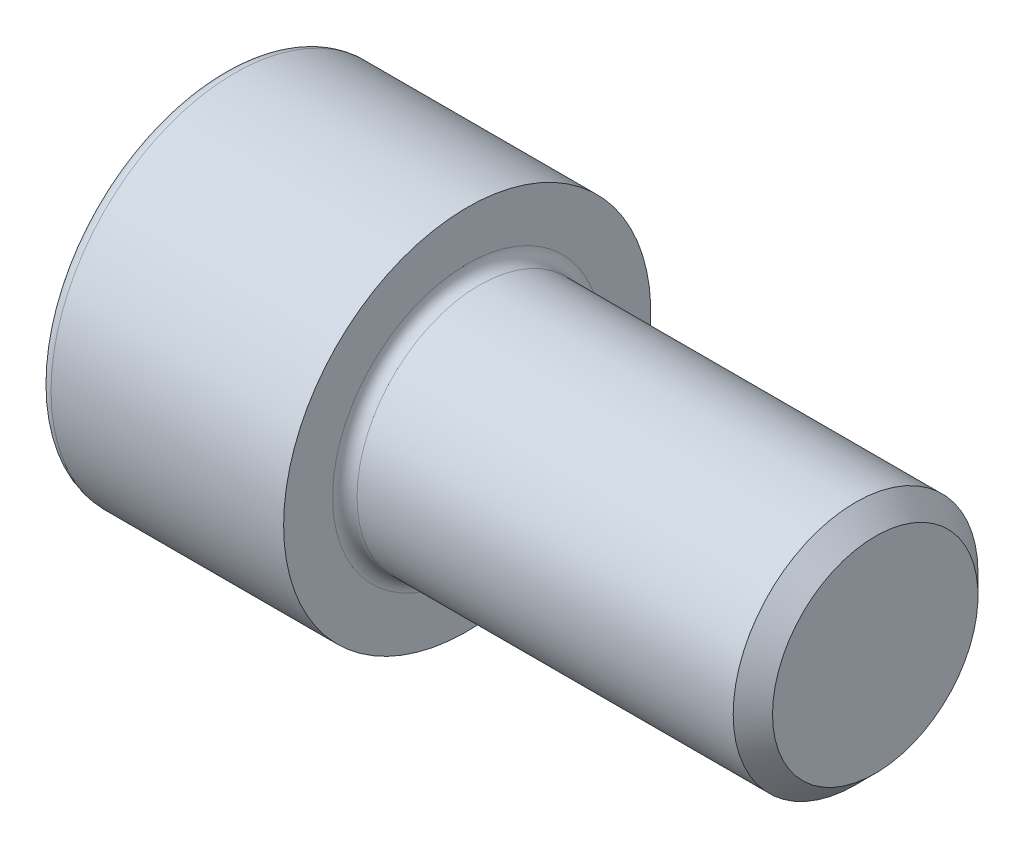
ISO-10303-21;
HEADER;
FILE_DESCRIPTION(('STEP AP214'),'2;1');
FILE_NAME('part.step','',(''),(''),'','','');
FILE_SCHEMA(('AUTOMOTIVE_DESIGN { 1 0 10303 214 1 1 1 1 }'));
ENDSEC;
DATA;
#1=APPLICATION_CONTEXT('core data for automotive mechanical design processes');
#2=APPLICATION_PROTOCOL_DEFINITION('international standard','automotive_design',2000,#1);
#3=PRODUCT_CONTEXT('',#1,'mechanical');
#4=PRODUCT('Part','Part','',(#3));
#5=PRODUCT_RELATED_PRODUCT_CATEGORY('part','',(#4));
#6=PRODUCT_DEFINITION_FORMATION('','',#4);
#7=PRODUCT_DEFINITION_CONTEXT('part definition',#1,'design');
#8=PRODUCT_DEFINITION('design','',#6,#7);
#9=PRODUCT_DEFINITION_SHAPE('','',#8);
#10=(LENGTH_UNIT() NAMED_UNIT(*) SI_UNIT(.MILLI.,.METRE.));
#11=(NAMED_UNIT(*) PLANE_ANGLE_UNIT() SI_UNIT($,.RADIAN.));
#12=(NAMED_UNIT(*) SI_UNIT($,.STERADIAN.) SOLID_ANGLE_UNIT());
#13=UNCERTAINTY_MEASURE_WITH_UNIT(LENGTH_MEASURE(1.E-05),#10,'distance_accuracy_value','');
#14=(GEOMETRIC_REPRESENTATION_CONTEXT(3) GLOBAL_UNCERTAINTY_ASSIGNED_CONTEXT((#13)) GLOBAL_UNIT_ASSIGNED_CONTEXT((#10,
#11,#12)) REPRESENTATION_CONTEXT('',''));
#15=CARTESIAN_POINT('',(0.,0.,0.));
#16=DIRECTION('',(0.,0.,1.));
#17=DIRECTION('',(1.,0.,0.));
#18=AXIS2_PLACEMENT_3D('',#15,#16,#17);
#19=CARTESIAN_POINT('',(0.,0.,0.));
#20=DIRECTION('',(-1.,0.,0.));
#21=DIRECTION('',(0.,0.,1.));
#22=AXIS2_PLACEMENT_3D('',#19,#20,#21);
#23=PLANE('',#22);
#24=DIRECTION('',(0.,-0.499999999999999,0.866025403784439));
#25=VECTOR('',#24,1.);
#26=CARTESIAN_POINT('',(0.,5.83989797285306,0.));
#27=LINE('',#26,#25);
#28=CARTESIAN_POINT('',(0.,5.83989797285306,0.));
#29=VERTEX_POINT('',#28);
#30=CARTESIAN_POINT('',(0.,2.91994898642654,5.05749999999999));
#31=VERTEX_POINT('',#30);
#32=EDGE_CURVE('E258',#29,#31,#27,.T.);
#33=ORIENTED_EDGE('',*,*,#32,.T.);
#34=DIRECTION('',(0.,1.,0.));
#35=VECTOR('',#34,1.);
#36=CARTESIAN_POINT('',(0.,-2.91994898642653,5.0575));
#37=LINE('',#36,#35);
#38=CARTESIAN_POINT('',(0.,-2.91994898642653,5.0575));
#39=VERTEX_POINT('',#38);
#40=EDGE_CURVE('E130',#39,#31,#37,.T.);
#41=ORIENTED_EDGE('',*,*,#40,.F.);
#42=DIRECTION('',(0.,-0.500000000000001,-0.866025403784438));
#43=VECTOR('',#42,1.);
#44=CARTESIAN_POINT('',(0.,-2.91994898642653,5.0575));
#45=LINE('',#44,#43);
#46=CARTESIAN_POINT('',(0.,-5.83989797285307,0.));
#47=VERTEX_POINT('',#46);
#48=EDGE_CURVE('E261',#39,#47,#45,.T.);
#49=ORIENTED_EDGE('',*,*,#48,.T.);
#50=DIRECTION('',(0.,0.499999999999999,-0.866025403784439));
#51=VECTOR('',#50,1.);
#52=CARTESIAN_POINT('',(0.,-5.83989797285307,0.));
#53=LINE('',#52,#51);
#54=CARTESIAN_POINT('',(0.,-2.91994898642654,-5.0575));
#55=VERTEX_POINT('',#54);
#56=EDGE_CURVE('E264',#47,#55,#53,.T.);
#57=ORIENTED_EDGE('',*,*,#56,.T.);
#58=DIRECTION('',(0.,-1.,0.));
#59=VECTOR('',#58,1.);
#60=CARTESIAN_POINT('',(0.,2.91994898642652,-5.05750000000001));
#61=LINE('',#60,#59);
#62=CARTESIAN_POINT('',(0.,2.91994898642652,-5.05750000000001));
#63=VERTEX_POINT('',#62);
#64=EDGE_CURVE('E267',#63,#55,#61,.T.);
#65=ORIENTED_EDGE('',*,*,#64,.F.);
#66=DIRECTION('',(0.,-0.500000000000001,-0.866025403784438));
#67=VECTOR('',#66,1.);
#68=CARTESIAN_POINT('',(0.,5.83989797285306,0.));
#69=LINE('',#68,#67);
#70=EDGE_CURVE('E125',#29,#63,#69,.T.);
#71=ORIENTED_EDGE('',*,*,#70,.F.);
#72=EDGE_LOOP('',(#33,#41,#49,#57,#65,#71));
#73=FACE_BOUND('',#72,.T.);
#74=CARTESIAN_POINT('',(0.,0.,0.));
#75=DIRECTION('',(-1.,0.,0.));
#76=DIRECTION('',(0.,0.,1.));
#77=AXIS2_PLACEMENT_3D('',#74,#75,#76);
#78=CIRCLE('',#77,8.4);
#79=CARTESIAN_POINT('',(0.,0.,8.4));
#80=VERTEX_POINT('',#79);
#81=EDGE_CURVE('E42',#80,#80,#78,.T.);
#82=ORIENTED_EDGE('',*,*,#81,.T.);
#83=EDGE_LOOP('',(#82));
#84=FACE_BOUND('',#83,.T.);
#85=ADVANCED_FACE('F34',(#73,#84),#23,.T.);
#86=CARTESIAN_POINT('',(-31.75,0.,0.));
#87=DIRECTION('',(-1.,0.,0.));
#88=DIRECTION('',(0.,0.,1.));
#89=AXIS2_PLACEMENT_3D('',#86,#87,#88);
#90=CYLINDRICAL_SURFACE('',#89,9.);
#91=CARTESIAN_POINT('',(0.600000000000003,0.,0.));
#92=DIRECTION('',(-1.,0.,0.));
#93=DIRECTION('',(0.,0.,1.));
#94=AXIS2_PLACEMENT_3D('',#91,#92,#93);
#95=CIRCLE('',#94,9.);
#96=CARTESIAN_POINT('',(0.600000000000003,0.,9.));
#97=VERTEX_POINT('',#96);
#98=EDGE_CURVE('E11',#97,#97,#95,.F.);
#99=ORIENTED_EDGE('',*,*,#98,.T.);
#100=EDGE_LOOP('',(#99));
#101=FACE_BOUND('',#100,.T.);
#102=CARTESIAN_POINT('',(12.,0.,0.));
#103=DIRECTION('',(-1.,0.,0.));
#104=DIRECTION('',(0.,0.,1.));
#105=AXIS2_PLACEMENT_3D('',#102,#103,#104);
#106=CIRCLE('',#105,9.);
#107=CARTESIAN_POINT('',(12.,0.,9.));
#108=VERTEX_POINT('',#107);
#109=EDGE_CURVE('E148',#108,#108,#106,.T.);
#110=ORIENTED_EDGE('',*,*,#109,.T.);
#111=EDGE_LOOP('',(#110));
#112=FACE_BOUND('',#111,.T.);
#113=ADVANCED_FACE('F172',(#101,#112),#90,.T.);
#114=CARTESIAN_POINT('',(12.,9.,0.));
#115=DIRECTION('',(1.,0.,0.));
#116=DIRECTION('',(0.,0.,-1.));
#117=AXIS2_PLACEMENT_3D('',#114,#115,#116);
#118=PLANE('',#117);
#119=CARTESIAN_POINT('',(12.,0.,0.));
#120=DIRECTION('',(1.,0.,0.));
#121=DIRECTION('',(0.,0.,-1.));
#122=AXIS2_PLACEMENT_3D('',#119,#120,#121);
#123=CIRCLE('',#122,6.6);
#124=CARTESIAN_POINT('',(12.,0.,-6.6));
#125=VERTEX_POINT('',#124);
#126=EDGE_CURVE('E151',#125,#125,#123,.F.);
#127=ORIENTED_EDGE('',*,*,#126,.T.);
#128=EDGE_LOOP('',(#127));
#129=FACE_BOUND('',#128,.T.);
#130=ORIENTED_EDGE('',*,*,#109,.F.);
#131=EDGE_LOOP('',(#130));
#132=FACE_BOUND('',#131,.T.);
#133=ADVANCED_FACE('F178',(#129,#132),#118,.T.);
#134=CARTESIAN_POINT('',(-31.75,0.,0.));
#135=DIRECTION('',(-1.,0.,0.));
#136=DIRECTION('',(0.,0.,1.));
#137=AXIS2_PLACEMENT_3D('',#134,#135,#136);
#138=CYLINDRICAL_SURFACE('',#137,6.);
#139=CARTESIAN_POINT('',(12.6,0.,0.));
#140=DIRECTION('',(1.,0.,0.));
#141=DIRECTION('',(0.,0.,-1.));
#142=AXIS2_PLACEMENT_3D('',#139,#140,#141);
#143=CIRCLE('',#142,6.);
#144=CARTESIAN_POINT('',(12.6,0.,-6.));
#145=VERTEX_POINT('',#144);
#146=EDGE_CURVE('E154',#145,#145,#143,.T.);
#147=ORIENTED_EDGE('',*,*,#146,.T.);
#148=EDGE_LOOP('',(#147));
#149=FACE_BOUND('',#148,.T.);
#150=CARTESIAN_POINT('',(31.036,0.,0.));
#151=DIRECTION('',(-1.,0.,0.));
#152=DIRECTION('',(0.,0.,1.));
#153=AXIS2_PLACEMENT_3D('',#150,#151,#152);
#154=CIRCLE('',#153,6.);
#155=CARTESIAN_POINT('',(31.036,0.,6.));
#156=VERTEX_POINT('',#155);
#157=EDGE_CURVE('E145',#156,#156,#154,.T.);
#158=ORIENTED_EDGE('',*,*,#157,.T.);
#159=EDGE_LOOP('',(#158));
#160=FACE_BOUND('',#159,.T.);
#161=ADVANCED_FACE('F184',(#149,#160),#138,.T.);
#162=CARTESIAN_POINT('',(32.,0.,0.));
#163=DIRECTION('',(-1.,0.,0.));
#164=DIRECTION('',(0.,0.,1.));
#165=AXIS2_PLACEMENT_3D('',#162,#163,#164);
#166=CONICAL_SURFACE('',#165,5.036,0.78539816339746);
#167=ORIENTED_EDGE('',*,*,#157,.F.);
#168=EDGE_LOOP('',(#167));
#169=FACE_BOUND('',#168,.T.);
#170=CARTESIAN_POINT('',(32.,0.,0.));
#171=DIRECTION('',(-1.,0.,0.));
#172=DIRECTION('',(0.,0.,1.));
#173=AXIS2_PLACEMENT_3D('',#170,#171,#172);
#174=CIRCLE('',#173,5.036);
#175=CARTESIAN_POINT('',(32.,0.,5.036));
#176=VERTEX_POINT('',#175);
#177=EDGE_CURVE('E141',#176,#176,#174,.T.);
#178=ORIENTED_EDGE('',*,*,#177,.T.);
#179=EDGE_LOOP('',(#178));
#180=FACE_BOUND('',#179,.T.);
#181=ADVANCED_FACE('F188',(#169,#180),#166,.T.);
#182=CARTESIAN_POINT('',(32.,5.036,0.));
#183=DIRECTION('',(1.,0.,0.));
#184=DIRECTION('',(0.,0.,-1.));
#185=AXIS2_PLACEMENT_3D('',#182,#183,#184);
#186=PLANE('',#185);
#187=ORIENTED_EDGE('',*,*,#177,.F.);
#188=EDGE_LOOP('',(#187));
#189=FACE_BOUND('',#188,.T.);
#190=ADVANCED_FACE('F168',(#189),#186,.T.);
#191=CARTESIAN_POINT('',(12.6,0.,0.));
#192=DIRECTION('',(1.,0.,0.));
#193=DIRECTION('',(0.,0.,-1.));
#194=AXIS2_PLACEMENT_3D('',#191,#192,#193);
#195=TOROIDAL_SURFACE('',#194,6.6,0.6);
#196=ORIENTED_EDGE('',*,*,#146,.F.);
#197=EDGE_LOOP('',(#196));
#198=FACE_BOUND('',#197,.T.);
#199=ORIENTED_EDGE('',*,*,#126,.F.);
#200=EDGE_LOOP('',(#199));
#201=FACE_BOUND('',#200,.T.);
#202=ADVANCED_FACE('F161',(#198,#201),#195,.F.);
#203=CARTESIAN_POINT('',(0.600000000000003,0.,0.));
#204=DIRECTION('',(-1.,0.,0.));
#205=DIRECTION('',(0.,0.,1.));
#206=AXIS2_PLACEMENT_3D('',#203,#204,#205);
#207=TOROIDAL_SURFACE('',#206,8.4,0.6);
#208=ORIENTED_EDGE('',*,*,#98,.F.);
#209=EDGE_LOOP('',(#208));
#210=FACE_BOUND('',#209,.T.);
#211=ORIENTED_EDGE('',*,*,#81,.F.);
#212=EDGE_LOOP('',(#211));
#213=FACE_BOUND('',#212,.T.);
#214=ADVANCED_FACE('F36',(#210,#213),#207,.T.);
#215=CARTESIAN_POINT('',(6.,5.83989797285306,0.));
#216=DIRECTION('',(0.,-0.866025403784439,-0.499999999999999));
#217=DIRECTION('',(0.,0.499999999999999,-0.866025403784439));
#218=AXIS2_PLACEMENT_3D('',#215,#216,#217);
#219=PLANE('',#218);
#220=ORIENTED_EDGE('',*,*,#32,.F.);
#221=DIRECTION('',(-1.,0.,0.));
#222=VECTOR('',#221,1.);
#223=CARTESIAN_POINT('',(6.,5.83989797285306,0.));
#224=LINE('',#223,#222);
#225=CARTESIAN_POINT('',(6.,5.83989797285306,0.));
#226=VERTEX_POINT('',#225);
#227=EDGE_CURVE('E248',#226,#29,#224,.T.);
#228=ORIENTED_EDGE('',*,*,#227,.F.);
#229=DIRECTION('',(0.,-0.499999999999999,0.866025403784439));
#230=VECTOR('',#229,1.);
#231=CARTESIAN_POINT('',(6.,5.83989797285306,0.));
#232=LINE('',#231,#230);
#233=CARTESIAN_POINT('',(6.,4.3799234796398,2.52874999999999));
#234=VERTEX_POINT('',#233);
#235=EDGE_CURVE('E117',#226,#234,#232,.T.);
#236=ORIENTED_EDGE('',*,*,#235,.T.);
#237=CARTESIAN_POINT('',(6.,2.91994898642654,5.05749999999999));
#238=VERTEX_POINT('',#237);
#239=EDGE_CURVE('E108',#234,#238,#232,.T.);
#240=ORIENTED_EDGE('',*,*,#239,.T.);
#241=DIRECTION('',(-1.,0.,0.));
#242=VECTOR('',#241,1.);
#243=CARTESIAN_POINT('',(6.,2.91994898642654,5.05749999999999));
#244=LINE('',#243,#242);
#245=EDGE_CURVE('E122',#238,#31,#244,.T.);
#246=ORIENTED_EDGE('',*,*,#245,.T.);
#247=EDGE_LOOP('',(#220,#228,#236,#240,#246));
#248=FACE_BOUND('',#247,.T.);
#249=ADVANCED_FACE('F121',(#248),#219,.T.);
#250=CARTESIAN_POINT('',(6.,-2.91994898642653,5.0575));
#251=DIRECTION('',(0.,0.,1.));
#252=DIRECTION('',(0.,-1.,0.));
#253=AXIS2_PLACEMENT_3D('',#250,#251,#252);
#254=PLANE('',#253);
#255=ORIENTED_EDGE('',*,*,#40,.T.);
#256=ORIENTED_EDGE('',*,*,#245,.F.);
#257=DIRECTION('',(0.,1.,0.));
#258=VECTOR('',#257,1.);
#259=CARTESIAN_POINT('',(6.,-2.91994898642653,5.0575));
#260=LINE('',#259,#258);
#261=CARTESIAN_POINT('',(6.,0.,5.0575));
#262=VERTEX_POINT('',#261);
#263=EDGE_CURVE('E105',#262,#238,#260,.T.);
#264=ORIENTED_EDGE('',*,*,#263,.F.);
#265=CARTESIAN_POINT('',(6.,-2.91994898642653,5.0575));
#266=VERTEX_POINT('',#265);
#267=EDGE_CURVE('E116',#266,#262,#260,.T.);
#268=ORIENTED_EDGE('',*,*,#267,.F.);
#269=DIRECTION('',(-1.,0.,0.));
#270=VECTOR('',#269,1.);
#271=CARTESIAN_POINT('',(6.,-2.91994898642653,5.0575));
#272=LINE('',#271,#270);
#273=EDGE_CURVE('E132',#266,#39,#272,.T.);
#274=ORIENTED_EDGE('',*,*,#273,.T.);
#275=EDGE_LOOP('',(#255,#256,#264,#268,#274));
#276=FACE_BOUND('',#275,.T.);
#277=ADVANCED_FACE('F127',(#276),#254,.F.);
#278=CARTESIAN_POINT('',(6.,-2.91994898642653,5.0575));
#279=DIRECTION('',(0.,0.866025403784438,-0.500000000000001));
#280=DIRECTION('',(0.,0.500000000000001,0.866025403784438));
#281=AXIS2_PLACEMENT_3D('',#278,#279,#280);
#282=PLANE('',#281);
#283=ORIENTED_EDGE('',*,*,#48,.F.);
#284=ORIENTED_EDGE('',*,*,#273,.F.);
#285=DIRECTION('',(0.,-0.500000000000001,-0.866025403784438));
#286=VECTOR('',#285,1.);
#287=CARTESIAN_POINT('',(6.,-2.91994898642653,5.0575));
#288=LINE('',#287,#286);
#289=CARTESIAN_POINT('',(6.,-4.3799234796398,2.52875));
#290=VERTEX_POINT('',#289);
#291=EDGE_CURVE('E287',#266,#290,#288,.T.);
#292=ORIENTED_EDGE('',*,*,#291,.T.);
#293=CARTESIAN_POINT('',(6.,-5.83989797285307,0.));
#294=VERTEX_POINT('',#293);
#295=EDGE_CURVE('E276',#290,#294,#288,.T.);
#296=ORIENTED_EDGE('',*,*,#295,.T.);
#297=DIRECTION('',(-1.,0.,0.));
#298=VECTOR('',#297,1.);
#299=CARTESIAN_POINT('',(6.,-5.83989797285307,0.));
#300=LINE('',#299,#298);
#301=EDGE_CURVE('E137',#294,#47,#300,.T.);
#302=ORIENTED_EDGE('',*,*,#301,.T.);
#303=EDGE_LOOP('',(#283,#284,#292,#296,#302));
#304=FACE_BOUND('',#303,.T.);
#305=ADVANCED_FACE('F202',(#304),#282,.T.);
#306=CARTESIAN_POINT('',(6.,-5.83989797285307,0.));
#307=DIRECTION('',(0.,0.866025403784439,0.499999999999999));
#308=DIRECTION('',(0.,-0.499999999999999,0.866025403784439));
#309=AXIS2_PLACEMENT_3D('',#306,#307,#308);
#310=PLANE('',#309);
#311=ORIENTED_EDGE('',*,*,#56,.F.);
#312=ORIENTED_EDGE('',*,*,#301,.F.);
#313=DIRECTION('',(0.,0.499999999999999,-0.866025403784439));
#314=VECTOR('',#313,1.);
#315=CARTESIAN_POINT('',(6.,-5.83989797285307,0.));
#316=LINE('',#315,#314);
#317=CARTESIAN_POINT('',(6.,-4.37992347963981,-2.52875));
#318=VERTEX_POINT('',#317);
#319=EDGE_CURVE('E254',#294,#318,#316,.T.);
#320=ORIENTED_EDGE('',*,*,#319,.T.);
#321=CARTESIAN_POINT('',(6.,-2.91994898642654,-5.0575));
#322=VERTEX_POINT('',#321);
#323=EDGE_CURVE('E286',#318,#322,#316,.T.);
#324=ORIENTED_EDGE('',*,*,#323,.T.);
#325=DIRECTION('',(-1.,0.,0.));
#326=VECTOR('',#325,1.);
#327=CARTESIAN_POINT('',(6.,-2.91994898642654,-5.0575));
#328=LINE('',#327,#326);
#329=EDGE_CURVE('E247',#322,#55,#328,.T.);
#330=ORIENTED_EDGE('',*,*,#329,.T.);
#331=EDGE_LOOP('',(#311,#312,#320,#324,#330));
#332=FACE_BOUND('',#331,.T.);
#333=ADVANCED_FACE('F205',(#332),#310,.T.);
#334=CARTESIAN_POINT('',(6.,2.91994898642652,-5.05750000000001));
#335=DIRECTION('',(0.,0.,-1.));
#336=DIRECTION('',(0.,1.,0.));
#337=AXIS2_PLACEMENT_3D('',#334,#335,#336);
#338=PLANE('',#337);
#339=ORIENTED_EDGE('',*,*,#64,.T.);
#340=ORIENTED_EDGE('',*,*,#329,.F.);
#341=DIRECTION('',(0.,-1.,0.));
#342=VECTOR('',#341,1.);
#343=CARTESIAN_POINT('',(6.,2.91994898642652,-5.05750000000001));
#344=LINE('',#343,#342);
#345=CARTESIAN_POINT('',(6.,0.,-5.0575));
#346=VERTEX_POINT('',#345);
#347=EDGE_CURVE('E251',#346,#322,#344,.T.);
#348=ORIENTED_EDGE('',*,*,#347,.F.);
#349=CARTESIAN_POINT('',(6.,2.91994898642652,-5.05750000000001));
#350=VERTEX_POINT('',#349);
#351=EDGE_CURVE('E49',#350,#346,#344,.T.);
#352=ORIENTED_EDGE('',*,*,#351,.F.);
#353=DIRECTION('',(-1.,0.,0.));
#354=VECTOR('',#353,1.);
#355=CARTESIAN_POINT('',(6.,2.91994898642652,-5.05750000000001));
#356=LINE('',#355,#354);
#357=EDGE_CURVE('E244',#350,#63,#356,.T.);
#358=ORIENTED_EDGE('',*,*,#357,.T.);
#359=EDGE_LOOP('',(#339,#340,#348,#352,#358));
#360=FACE_BOUND('',#359,.T.);
#361=ADVANCED_FACE('F209',(#360),#338,.F.);
#362=CARTESIAN_POINT('',(6.,5.83989797285306,0.));
#363=DIRECTION('',(0.,0.866025403784438,-0.500000000000001));
#364=DIRECTION('',(0.,0.500000000000001,0.866025403784438));
#365=AXIS2_PLACEMENT_3D('',#362,#363,#364);
#366=PLANE('',#365);
#367=ORIENTED_EDGE('',*,*,#70,.T.);
#368=ORIENTED_EDGE('',*,*,#357,.F.);
#369=DIRECTION('',(0.,-0.500000000000001,-0.866025403784438));
#370=VECTOR('',#369,1.);
#371=CARTESIAN_POINT('',(6.,5.83989797285306,0.));
#372=LINE('',#371,#370);
#373=CARTESIAN_POINT('',(6.,4.37992347963979,-2.52875000000001));
#374=VERTEX_POINT('',#373);
#375=EDGE_CURVE('E234',#374,#350,#372,.T.);
#376=ORIENTED_EDGE('',*,*,#375,.F.);
#377=EDGE_CURVE('E240',#226,#374,#372,.T.);
#378=ORIENTED_EDGE('',*,*,#377,.F.);
#379=ORIENTED_EDGE('',*,*,#227,.T.);
#380=EDGE_LOOP('',(#367,#368,#376,#378,#379));
#381=FACE_BOUND('',#380,.T.);
#382=ADVANCED_FACE('F213',(#381),#366,.F.);
#383=CARTESIAN_POINT('',(6.,5.83989797285306,0.));
#384=DIRECTION('',(1.,0.,0.));
#385=DIRECTION('',(0.,0.,-1.));
#386=AXIS2_PLACEMENT_3D('',#383,#384,#385);
#387=PLANE('',#386);
#388=ORIENTED_EDGE('',*,*,#347,.T.);
#389=ORIENTED_EDGE('',*,*,#323,.F.);
#390=CARTESIAN_POINT('',(6.,0.,0.));
#391=DIRECTION('',(-1.,0.,0.));
#392=DIRECTION('',(0.,0.,1.));
#393=AXIS2_PLACEMENT_3D('',#390,#391,#392);
#394=CIRCLE('',#393,5.0575);
#395=EDGE_CURVE('E282',#346,#318,#394,.T.);
#396=ORIENTED_EDGE('',*,*,#395,.F.);
#397=EDGE_LOOP('',(#388,#389,#396));
#398=FACE_BOUND('',#397,.T.);
#399=ADVANCED_FACE('F217',(#398),#387,.F.);
#400=ORIENTED_EDGE('',*,*,#319,.F.);
#401=ORIENTED_EDGE('',*,*,#295,.F.);
#402=EDGE_CURVE('E135',#318,#290,#394,.T.);
#403=ORIENTED_EDGE('',*,*,#402,.F.);
#404=EDGE_LOOP('',(#400,#401,#403));
#405=FACE_BOUND('',#404,.T.);
#406=ADVANCED_FACE('F220',(#405),#387,.F.);
#407=ORIENTED_EDGE('',*,*,#291,.F.);
#408=ORIENTED_EDGE('',*,*,#267,.T.);
#409=EDGE_CURVE('E131',#290,#262,#394,.T.);
#410=ORIENTED_EDGE('',*,*,#409,.F.);
#411=EDGE_LOOP('',(#407,#408,#410));
#412=FACE_BOUND('',#411,.T.);
#413=ADVANCED_FACE('F225',(#412),#387,.F.);
#414=ORIENTED_EDGE('',*,*,#263,.T.);
#415=ORIENTED_EDGE('',*,*,#239,.F.);
#416=EDGE_CURVE('E111',#262,#234,#394,.T.);
#417=ORIENTED_EDGE('',*,*,#416,.F.);
#418=EDGE_LOOP('',(#414,#415,#417));
#419=FACE_BOUND('',#418,.T.);
#420=ADVANCED_FACE('F107',(#419),#387,.F.);
#421=ORIENTED_EDGE('',*,*,#235,.F.);
#422=ORIENTED_EDGE('',*,*,#377,.T.);
#423=EDGE_CURVE('E142',#234,#374,#394,.T.);
#424=ORIENTED_EDGE('',*,*,#423,.F.);
#425=EDGE_LOOP('',(#421,#422,#424));
#426=FACE_BOUND('',#425,.T.);
#427=ADVANCED_FACE('F228',(#426),#387,.F.);
#428=ORIENTED_EDGE('',*,*,#375,.T.);
#429=ORIENTED_EDGE('',*,*,#351,.T.);
#430=EDGE_CURVE('E237',#374,#346,#394,.T.);
#431=ORIENTED_EDGE('',*,*,#430,.F.);
#432=EDGE_LOOP('',(#428,#429,#431));
#433=FACE_BOUND('',#432,.T.);
#434=ADVANCED_FACE('F198',(#433),#387,.F.);
#435=CARTESIAN_POINT('',(6.,0.,0.));
#436=DIRECTION('',(-1.,0.,0.));
#437=DIRECTION('',(0.,0.,1.));
#438=AXIS2_PLACEMENT_3D('',#435,#436,#437);
#439=CONICAL_SURFACE('',#438,5.0575,1.04719755119659);
#440=CARTESIAN_POINT('',(8.91994898642657,0.,0.));
#441=VERTEX_POINT('',#440);
#442=VERTEX_LOOP('',#441);
#443=FACE_BOUND('',#442,.T.);
#444=ORIENTED_EDGE('',*,*,#416,.T.);
#445=ORIENTED_EDGE('',*,*,#423,.T.);
#446=ORIENTED_EDGE('',*,*,#430,.T.);
#447=ORIENTED_EDGE('',*,*,#395,.T.);
#448=ORIENTED_EDGE('',*,*,#402,.T.);
#449=ORIENTED_EDGE('',*,*,#409,.T.);
#450=EDGE_LOOP('',(#444,#445,#446,#447,#448,#449));
#451=FACE_BOUND('',#450,.T.);
#452=ADVANCED_FACE('F196',(#443,#451),#439,.F.);
#453=CLOSED_SHELL('',(#85,#113,#133,#161,#181,#190,#202,#214,#249,#277,#305,#333,#361,#382,#399,
#406,#413,#420,#427,#434,#452));
#454=MANIFOLD_SOLID_BREP('B2',#453);
#455=ADVANCED_BREP_SHAPE_REPRESENTATION('',(#18,#454),#14);
#456=SHAPE_DEFINITION_REPRESENTATION(#9,#455);
ENDSEC;
END-ISO-10303-21;
